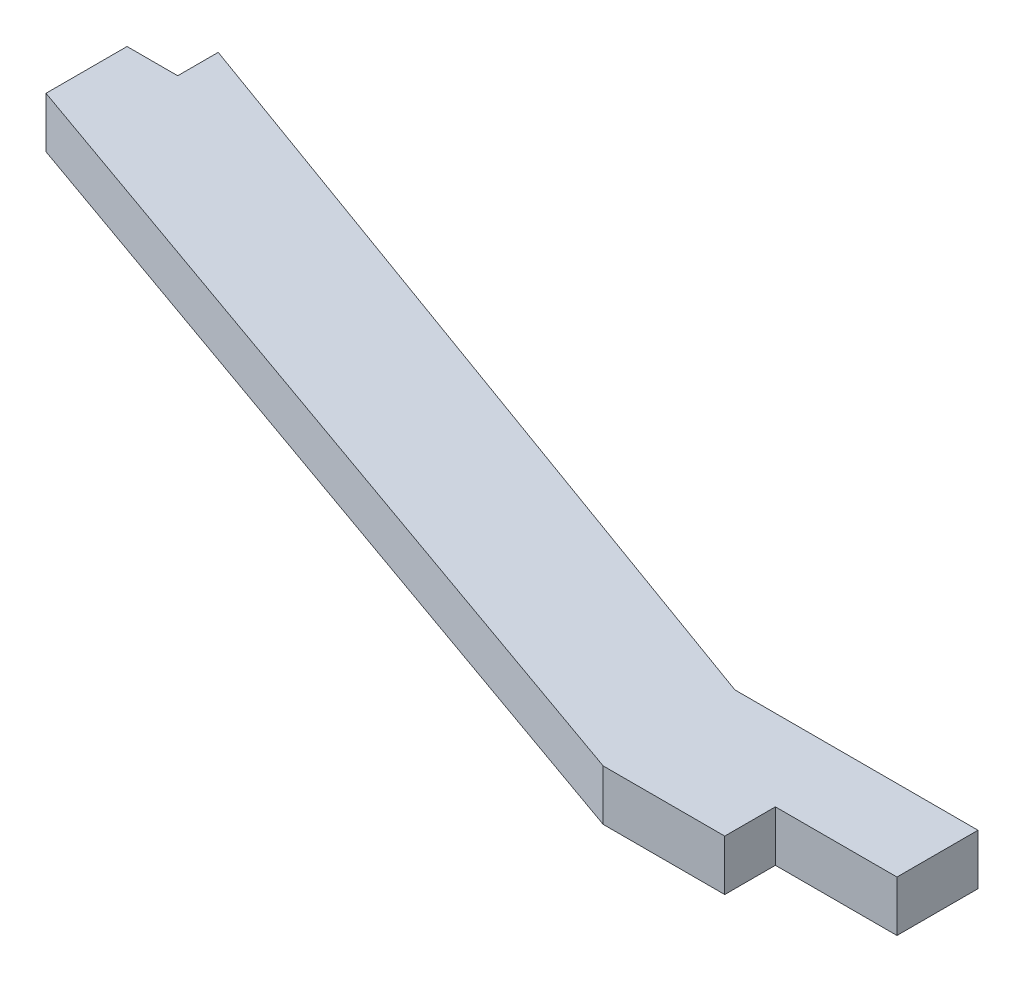
ISO-10303-21;
HEADER;
FILE_DESCRIPTION(('STEP AP214'),'2;1');
FILE_NAME('part.step','',(''),(''),'','','');
FILE_SCHEMA(('AUTOMOTIVE_DESIGN { 1 0 10303 214 1 1 1 1 }'));
ENDSEC;
DATA;
#1=APPLICATION_CONTEXT('core data for automotive mechanical design processes');
#2=APPLICATION_PROTOCOL_DEFINITION('international standard','automotive_design',2000,#1);
#3=PRODUCT_CONTEXT('',#1,'mechanical');
#4=PRODUCT('Part','Part','',(#3));
#5=PRODUCT_RELATED_PRODUCT_CATEGORY('part','',(#4));
#6=PRODUCT_DEFINITION_FORMATION('','',#4);
#7=PRODUCT_DEFINITION_CONTEXT('part definition',#1,'design');
#8=PRODUCT_DEFINITION('design','',#6,#7);
#9=PRODUCT_DEFINITION_SHAPE('','',#8);
#10=(LENGTH_UNIT() NAMED_UNIT(*) SI_UNIT(.MILLI.,.METRE.));
#11=(NAMED_UNIT(*) PLANE_ANGLE_UNIT() SI_UNIT($,.RADIAN.));
#12=(NAMED_UNIT(*) SI_UNIT($,.STERADIAN.) SOLID_ANGLE_UNIT());
#13=UNCERTAINTY_MEASURE_WITH_UNIT(LENGTH_MEASURE(1.E-05),#10,'distance_accuracy_value','');
#14=(GEOMETRIC_REPRESENTATION_CONTEXT(3) GLOBAL_UNCERTAINTY_ASSIGNED_CONTEXT((#13)) GLOBAL_UNIT_ASSIGNED_CONTEXT((#10,
#11,#12)) REPRESENTATION_CONTEXT('',''));
#15=CARTESIAN_POINT('',(0.,0.,0.));
#16=DIRECTION('',(0.,0.,1.));
#17=DIRECTION('',(1.,0.,0.));
#18=AXIS2_PLACEMENT_3D('',#15,#16,#17);
#19=CARTESIAN_POINT('',(3.175,3.175,0.));
#20=DIRECTION('',(0.,0.,1.));
#21=DIRECTION('',(1.,0.,0.));
#22=AXIS2_PLACEMENT_3D('',#19,#20,#21);
#23=PLANE('',#22);
#24=DIRECTION('',(-1.,0.,0.));
#25=VECTOR('',#24,1.);
#26=CARTESIAN_POINT('',(3.175,0.,0.));
#27=LINE('',#26,#25);
#28=CARTESIAN_POINT('',(3.175,0.,0.));
#29=VERTEX_POINT('',#28);
#30=CARTESIAN_POINT('',(0.,0.,0.));
#31=VERTEX_POINT('',#30);
#32=EDGE_CURVE('E142',#29,#31,#27,.T.);
#33=ORIENTED_EDGE('',*,*,#32,.T.);
#34=DIRECTION('',(0.,-1.,0.));
#35=VECTOR('',#34,1.);
#36=CARTESIAN_POINT('',(0.,3.175,0.));
#37=LINE('',#36,#35);
#38=CARTESIAN_POINT('',(0.,3.175,0.));
#39=VERTEX_POINT('',#38);
#40=EDGE_CURVE('E11',#39,#31,#37,.T.);
#41=ORIENTED_EDGE('',*,*,#40,.F.);
#42=DIRECTION('',(-1.,0.,0.));
#43=VECTOR('',#42,1.);
#44=CARTESIAN_POINT('',(3.175,3.175,0.));
#45=LINE('',#44,#43);
#46=CARTESIAN_POINT('',(3.175,3.175,0.));
#47=VERTEX_POINT('',#46);
#48=EDGE_CURVE('E160',#47,#39,#45,.T.);
#49=ORIENTED_EDGE('',*,*,#48,.F.);
#50=DIRECTION('',(0.,-1.,0.));
#51=VECTOR('',#50,1.);
#52=CARTESIAN_POINT('',(3.175,3.175,0.));
#53=LINE('',#52,#51);
#54=EDGE_CURVE('E138',#47,#29,#53,.T.);
#55=ORIENTED_EDGE('',*,*,#54,.T.);
#56=EDGE_LOOP('',(#33,#41,#49,#55));
#57=FACE_BOUND('',#56,.T.);
#58=ADVANCED_FACE('F34',(#57),#23,.F.);
#59=CARTESIAN_POINT('',(0.,3.175,0.));
#60=DIRECTION('',(1.,0.,0.));
#61=DIRECTION('',(0.,0.,-1.));
#62=AXIS2_PLACEMENT_3D('',#59,#60,#61);
#63=PLANE('',#62);
#64=DIRECTION('',(0.,0.,1.));
#65=VECTOR('',#64,1.);
#66=CARTESIAN_POINT('',(0.,0.,0.));
#67=LINE('',#66,#65);
#68=CARTESIAN_POINT('',(0.,0.,5.08));
#69=VERTEX_POINT('',#68);
#70=EDGE_CURVE('E145',#31,#69,#67,.T.);
#71=ORIENTED_EDGE('',*,*,#70,.T.);
#72=DIRECTION('',(0.,-1.,0.));
#73=VECTOR('',#72,1.);
#74=CARTESIAN_POINT('',(0.,3.175,5.08));
#75=LINE('',#74,#73);
#76=CARTESIAN_POINT('',(0.,3.175,5.08));
#77=VERTEX_POINT('',#76);
#78=EDGE_CURVE('E42',#77,#69,#75,.T.);
#79=ORIENTED_EDGE('',*,*,#78,.F.);
#80=DIRECTION('',(0.,0.,1.));
#81=VECTOR('',#80,1.);
#82=CARTESIAN_POINT('',(0.,3.175,0.));
#83=LINE('',#82,#81);
#84=EDGE_CURVE('E99',#39,#77,#83,.T.);
#85=ORIENTED_EDGE('',*,*,#84,.F.);
#86=ORIENTED_EDGE('',*,*,#40,.T.);
#87=EDGE_LOOP('',(#71,#79,#85,#86));
#88=FACE_BOUND('',#87,.T.);
#89=ADVANCED_FACE('F209',(#88),#63,.F.);
#90=CARTESIAN_POINT('',(0.,3.175,5.08));
#91=DIRECTION('',(0.332820117735138,0.,-0.94299033358289));
#92=DIRECTION('',(-0.94299033358289,0.,-0.332820117735138));
#93=AXIS2_PLACEMENT_3D('',#90,#91,#92);
#94=PLANE('',#93);
#95=DIRECTION('',(0.942990333582889,0.,0.332820117735137));
#96=VECTOR('',#95,1.);
#97=CARTESIAN_POINT('',(0.,0.,5.08));
#98=LINE('',#97,#96);
#99=CARTESIAN_POINT('',(53.975,0.,24.13));
#100=VERTEX_POINT('',#99);
#101=EDGE_CURVE('E147',#69,#100,#98,.T.);
#102=ORIENTED_EDGE('',*,*,#101,.T.);
#103=DIRECTION('',(0.,-1.,0.));
#104=VECTOR('',#103,1.);
#105=CARTESIAN_POINT('',(53.975,3.175,24.13));
#106=LINE('',#105,#104);
#107=CARTESIAN_POINT('',(53.975,3.175,24.13));
#108=VERTEX_POINT('',#107);
#109=EDGE_CURVE('E173',#108,#100,#106,.T.);
#110=ORIENTED_EDGE('',*,*,#109,.F.);
#111=DIRECTION('',(0.942990333582889,0.,0.332820117735137));
#112=VECTOR('',#111,1.);
#113=CARTESIAN_POINT('',(0.,3.175,5.08));
#114=LINE('',#113,#112);
#115=EDGE_CURVE('E181',#77,#108,#114,.T.);
#116=ORIENTED_EDGE('',*,*,#115,.F.);
#117=ORIENTED_EDGE('',*,*,#78,.T.);
#118=EDGE_LOOP('',(#102,#110,#116,#117));
#119=FACE_BOUND('',#118,.T.);
#120=ADVANCED_FACE('F179',(#119),#94,.F.);
#121=CARTESIAN_POINT('',(53.975,3.175,24.13));
#122=DIRECTION('',(0.,0.,-1.));
#123=DIRECTION('',(-1.,0.,0.));
#124=AXIS2_PLACEMENT_3D('',#121,#122,#123);
#125=PLANE('',#124);
#126=DIRECTION('',(1.,0.,0.));
#127=VECTOR('',#126,1.);
#128=CARTESIAN_POINT('',(53.975,0.,24.13));
#129=LINE('',#128,#127);
#130=CARTESIAN_POINT('',(61.595,0.,24.13));
#131=VERTEX_POINT('',#130);
#132=EDGE_CURVE('E149',#100,#131,#129,.T.);
#133=ORIENTED_EDGE('',*,*,#132,.T.);
#134=DIRECTION('',(0.,-1.,0.));
#135=VECTOR('',#134,1.);
#136=CARTESIAN_POINT('',(61.595,3.175,24.13));
#137=LINE('',#136,#135);
#138=CARTESIAN_POINT('',(61.595,3.175,24.13));
#139=VERTEX_POINT('',#138);
#140=EDGE_CURVE('E170',#139,#131,#137,.T.);
#141=ORIENTED_EDGE('',*,*,#140,.F.);
#142=DIRECTION('',(1.,0.,0.));
#143=VECTOR('',#142,1.);
#144=CARTESIAN_POINT('',(53.975,3.175,24.13));
#145=LINE('',#144,#143);
#146=EDGE_CURVE('E199',#108,#139,#145,.T.);
#147=ORIENTED_EDGE('',*,*,#146,.F.);
#148=ORIENTED_EDGE('',*,*,#109,.T.);
#149=EDGE_LOOP('',(#133,#141,#147,#148));
#150=FACE_BOUND('',#149,.T.);
#151=ADVANCED_FACE('F190',(#150),#125,.F.);
#152=CARTESIAN_POINT('',(61.595,3.175,24.13));
#153=DIRECTION('',(-1.,0.,0.));
#154=DIRECTION('',(0.,0.,1.));
#155=AXIS2_PLACEMENT_3D('',#152,#153,#154);
#156=PLANE('',#155);
#157=DIRECTION('',(0.,0.,-1.));
#158=VECTOR('',#157,1.);
#159=CARTESIAN_POINT('',(61.595,0.,24.13));
#160=LINE('',#159,#158);
#161=CARTESIAN_POINT('',(61.595,0.,20.955));
#162=VERTEX_POINT('',#161);
#163=EDGE_CURVE('E151',#131,#162,#160,.T.);
#164=ORIENTED_EDGE('',*,*,#163,.T.);
#165=DIRECTION('',(0.,-1.,0.));
#166=VECTOR('',#165,1.);
#167=CARTESIAN_POINT('',(61.595,3.175,20.955));
#168=LINE('',#167,#166);
#169=CARTESIAN_POINT('',(61.595,3.175,20.955));
#170=VERTEX_POINT('',#169);
#171=EDGE_CURVE('E167',#170,#162,#168,.T.);
#172=ORIENTED_EDGE('',*,*,#171,.F.);
#173=DIRECTION('',(0.,0.,-1.));
#174=VECTOR('',#173,1.);
#175=CARTESIAN_POINT('',(61.595,3.175,24.13));
#176=LINE('',#175,#174);
#177=EDGE_CURVE('E196',#139,#170,#176,.T.);
#178=ORIENTED_EDGE('',*,*,#177,.F.);
#179=ORIENTED_EDGE('',*,*,#140,.T.);
#180=EDGE_LOOP('',(#164,#172,#178,#179));
#181=FACE_BOUND('',#180,.T.);
#182=ADVANCED_FACE('F194',(#181),#156,.F.);
#183=CARTESIAN_POINT('',(61.595,3.175,20.955));
#184=DIRECTION('',(0.,0.,-1.));
#185=DIRECTION('',(-1.,0.,0.));
#186=AXIS2_PLACEMENT_3D('',#183,#184,#185);
#187=PLANE('',#186);
#188=DIRECTION('',(1.,0.,0.));
#189=VECTOR('',#188,1.);
#190=CARTESIAN_POINT('',(61.595,0.,20.955));
#191=LINE('',#190,#189);
#192=CARTESIAN_POINT('',(69.215,0.,20.955));
#193=VERTEX_POINT('',#192);
#194=EDGE_CURVE('E153',#162,#193,#191,.T.);
#195=ORIENTED_EDGE('',*,*,#194,.T.);
#196=DIRECTION('',(0.,-1.,0.));
#197=VECTOR('',#196,1.);
#198=CARTESIAN_POINT('',(69.215,3.175,20.955));
#199=LINE('',#198,#197);
#200=CARTESIAN_POINT('',(69.215,3.175,20.955));
#201=VERTEX_POINT('',#200);
#202=EDGE_CURVE('E164',#201,#193,#199,.T.);
#203=ORIENTED_EDGE('',*,*,#202,.F.);
#204=DIRECTION('',(1.,0.,0.));
#205=VECTOR('',#204,1.);
#206=CARTESIAN_POINT('',(61.595,3.175,20.955));
#207=LINE('',#206,#205);
#208=EDGE_CURVE('E198',#170,#201,#207,.T.);
#209=ORIENTED_EDGE('',*,*,#208,.F.);
#210=ORIENTED_EDGE('',*,*,#171,.T.);
#211=EDGE_LOOP('',(#195,#203,#209,#210));
#212=FACE_BOUND('',#211,.T.);
#213=ADVANCED_FACE('F221',(#212),#187,.F.);
#214=CARTESIAN_POINT('',(69.215,3.175,20.955));
#215=DIRECTION('',(-1.,0.,0.));
#216=DIRECTION('',(0.,0.,1.));
#217=AXIS2_PLACEMENT_3D('',#214,#215,#216);
#218=PLANE('',#217);
#219=DIRECTION('',(0.,0.,-1.));
#220=VECTOR('',#219,1.);
#221=CARTESIAN_POINT('',(69.215,0.,20.955));
#222=LINE('',#221,#220);
#223=CARTESIAN_POINT('',(69.215,0.,15.875));
#224=VERTEX_POINT('',#223);
#225=EDGE_CURVE('E155',#193,#224,#222,.T.);
#226=ORIENTED_EDGE('',*,*,#225,.T.);
#227=DIRECTION('',(0.,-1.,0.));
#228=VECTOR('',#227,1.);
#229=CARTESIAN_POINT('',(69.215,3.175,15.875));
#230=LINE('',#229,#228);
#231=CARTESIAN_POINT('',(69.215,3.175,15.875));
#232=VERTEX_POINT('',#231);
#233=EDGE_CURVE('E133',#232,#224,#230,.T.);
#234=ORIENTED_EDGE('',*,*,#233,.F.);
#235=DIRECTION('',(0.,0.,-1.));
#236=VECTOR('',#235,1.);
#237=CARTESIAN_POINT('',(69.215,3.175,20.955));
#238=LINE('',#237,#236);
#239=EDGE_CURVE('E124',#201,#232,#238,.T.);
#240=ORIENTED_EDGE('',*,*,#239,.F.);
#241=ORIENTED_EDGE('',*,*,#202,.T.);
#242=EDGE_LOOP('',(#226,#234,#240,#241));
#243=FACE_BOUND('',#242,.T.);
#244=ADVANCED_FACE('F224',(#243),#218,.F.);
#245=CARTESIAN_POINT('',(69.215,3.175,15.875));
#246=DIRECTION('',(0.,0.,1.));
#247=DIRECTION('',(1.,0.,0.));
#248=AXIS2_PLACEMENT_3D('',#245,#246,#247);
#249=PLANE('',#248);
#250=DIRECTION('',(-1.,0.,0.));
#251=VECTOR('',#250,1.);
#252=CARTESIAN_POINT('',(69.215,0.,15.875));
#253=LINE('',#252,#251);
#254=CARTESIAN_POINT('',(53.975,0.,15.875));
#255=VERTEX_POINT('',#254);
#256=EDGE_CURVE('E132',#224,#255,#253,.T.);
#257=ORIENTED_EDGE('',*,*,#256,.T.);
#258=DIRECTION('',(0.,-1.,0.));
#259=VECTOR('',#258,1.);
#260=CARTESIAN_POINT('',(53.975,3.175,15.875));
#261=LINE('',#260,#259);
#262=CARTESIAN_POINT('',(53.975,3.175,15.875));
#263=VERTEX_POINT('',#262);
#264=EDGE_CURVE('E129',#263,#255,#261,.T.);
#265=ORIENTED_EDGE('',*,*,#264,.F.);
#266=DIRECTION('',(-1.,0.,0.));
#267=VECTOR('',#266,1.);
#268=CARTESIAN_POINT('',(69.215,3.175,15.875));
#269=LINE('',#268,#267);
#270=EDGE_CURVE('E118',#232,#263,#269,.T.);
#271=ORIENTED_EDGE('',*,*,#270,.F.);
#272=ORIENTED_EDGE('',*,*,#233,.T.);
#273=EDGE_LOOP('',(#257,#265,#271,#272));
#274=FACE_BOUND('',#273,.T.);
#275=ADVANCED_FACE('F130',(#274),#249,.F.);
#276=CARTESIAN_POINT('',(53.975,3.175,15.875));
#277=DIRECTION('',(-0.3407993236214,0.,0.940136065162483));
#278=DIRECTION('',(0.940136065162483,0.,0.3407993236214));
#279=AXIS2_PLACEMENT_3D('',#276,#277,#278);
#280=PLANE('',#279);
#281=DIRECTION('',(-0.940136065162483,0.,-0.3407993236214));
#282=VECTOR('',#281,1.);
#283=CARTESIAN_POINT('',(53.975,0.,15.875));
#284=LINE('',#283,#282);
#285=CARTESIAN_POINT('',(3.175,0.,-2.54));
#286=VERTEX_POINT('',#285);
#287=EDGE_CURVE('E85',#255,#286,#284,.T.);
#288=ORIENTED_EDGE('',*,*,#287,.T.);
#289=DIRECTION('',(0.,-1.,0.));
#290=VECTOR('',#289,1.);
#291=CARTESIAN_POINT('',(3.175,3.175,-2.54));
#292=LINE('',#291,#290);
#293=CARTESIAN_POINT('',(3.175,3.175,-2.54));
#294=VERTEX_POINT('',#293);
#295=EDGE_CURVE('E134',#294,#286,#292,.T.);
#296=ORIENTED_EDGE('',*,*,#295,.F.);
#297=DIRECTION('',(-0.940136065162483,0.,-0.3407993236214));
#298=VECTOR('',#297,1.);
#299=CARTESIAN_POINT('',(53.975,3.175,15.875));
#300=LINE('',#299,#298);
#301=EDGE_CURVE('E122',#263,#294,#300,.T.);
#302=ORIENTED_EDGE('',*,*,#301,.F.);
#303=ORIENTED_EDGE('',*,*,#264,.T.);
#304=EDGE_LOOP('',(#288,#296,#302,#303));
#305=FACE_BOUND('',#304,.T.);
#306=ADVANCED_FACE('F136',(#305),#280,.F.);
#307=CARTESIAN_POINT('',(3.175,3.175,-2.54));
#308=DIRECTION('',(1.,0.,0.));
#309=DIRECTION('',(0.,0.,-1.));
#310=AXIS2_PLACEMENT_3D('',#307,#308,#309);
#311=PLANE('',#310);
#312=DIRECTION('',(0.,0.,1.));
#313=VECTOR('',#312,1.);
#314=CARTESIAN_POINT('',(3.175,0.,-2.54));
#315=LINE('',#314,#313);
#316=EDGE_CURVE('E91',#286,#29,#315,.T.);
#317=ORIENTED_EDGE('',*,*,#316,.T.);
#318=ORIENTED_EDGE('',*,*,#54,.F.);
#319=DIRECTION('',(0.,0.,1.));
#320=VECTOR('',#319,1.);
#321=CARTESIAN_POINT('',(3.175,3.175,-2.54));
#322=LINE('',#321,#320);
#323=EDGE_CURVE('E50',#294,#47,#322,.T.);
#324=ORIENTED_EDGE('',*,*,#323,.F.);
#325=ORIENTED_EDGE('',*,*,#295,.T.);
#326=EDGE_LOOP('',(#317,#318,#324,#325));
#327=FACE_BOUND('',#326,.T.);
#328=ADVANCED_FACE('F233',(#327),#311,.F.);
#329=CARTESIAN_POINT('',(0.,3.175,0.));
#330=DIRECTION('',(0.,1.,0.));
#331=DIRECTION('',(0.,0.,1.));
#332=AXIS2_PLACEMENT_3D('',#329,#330,#331);
#333=PLANE('',#332);
#334=ORIENTED_EDGE('',*,*,#48,.T.);
#335=ORIENTED_EDGE('',*,*,#84,.T.);
#336=ORIENTED_EDGE('',*,*,#115,.T.);
#337=ORIENTED_EDGE('',*,*,#146,.T.);
#338=ORIENTED_EDGE('',*,*,#177,.T.);
#339=ORIENTED_EDGE('',*,*,#208,.T.);
#340=ORIENTED_EDGE('',*,*,#239,.T.);
#341=ORIENTED_EDGE('',*,*,#270,.T.);
#342=ORIENTED_EDGE('',*,*,#301,.T.);
#343=ORIENTED_EDGE('',*,*,#323,.T.);
#344=EDGE_LOOP('',(#334,#335,#336,#337,#338,#339,#340,#341,#342,#343));
#345=FACE_BOUND('',#344,.T.);
#346=ADVANCED_FACE('F120',(#345),#333,.T.);
#347=CARTESIAN_POINT('',(0.,0.,0.));
#348=DIRECTION('',(0.,1.,0.));
#349=DIRECTION('',(0.,0.,1.));
#350=AXIS2_PLACEMENT_3D('',#347,#348,#349);
#351=PLANE('',#350);
#352=ORIENTED_EDGE('',*,*,#32,.F.);
#353=ORIENTED_EDGE('',*,*,#316,.F.);
#354=ORIENTED_EDGE('',*,*,#287,.F.);
#355=ORIENTED_EDGE('',*,*,#256,.F.);
#356=ORIENTED_EDGE('',*,*,#225,.F.);
#357=ORIENTED_EDGE('',*,*,#194,.F.);
#358=ORIENTED_EDGE('',*,*,#163,.F.);
#359=ORIENTED_EDGE('',*,*,#132,.F.);
#360=ORIENTED_EDGE('',*,*,#101,.F.);
#361=ORIENTED_EDGE('',*,*,#70,.F.);
#362=EDGE_LOOP('',(#352,#353,#354,#355,#356,#357,#358,#359,#360,#361));
#363=FACE_BOUND('',#362,.T.);
#364=ADVANCED_FACE('F185',(#363),#351,.F.);
#365=CLOSED_SHELL('',(#58,#89,#120,#151,#182,#213,#244,#275,#306,#328,#346,#364));
#366=MANIFOLD_SOLID_BREP('B2',#365);
#367=ADVANCED_BREP_SHAPE_REPRESENTATION('',(#18,#366),#14);
#368=SHAPE_DEFINITION_REPRESENTATION(#9,#367);
ENDSEC;
END-ISO-10303-21;
